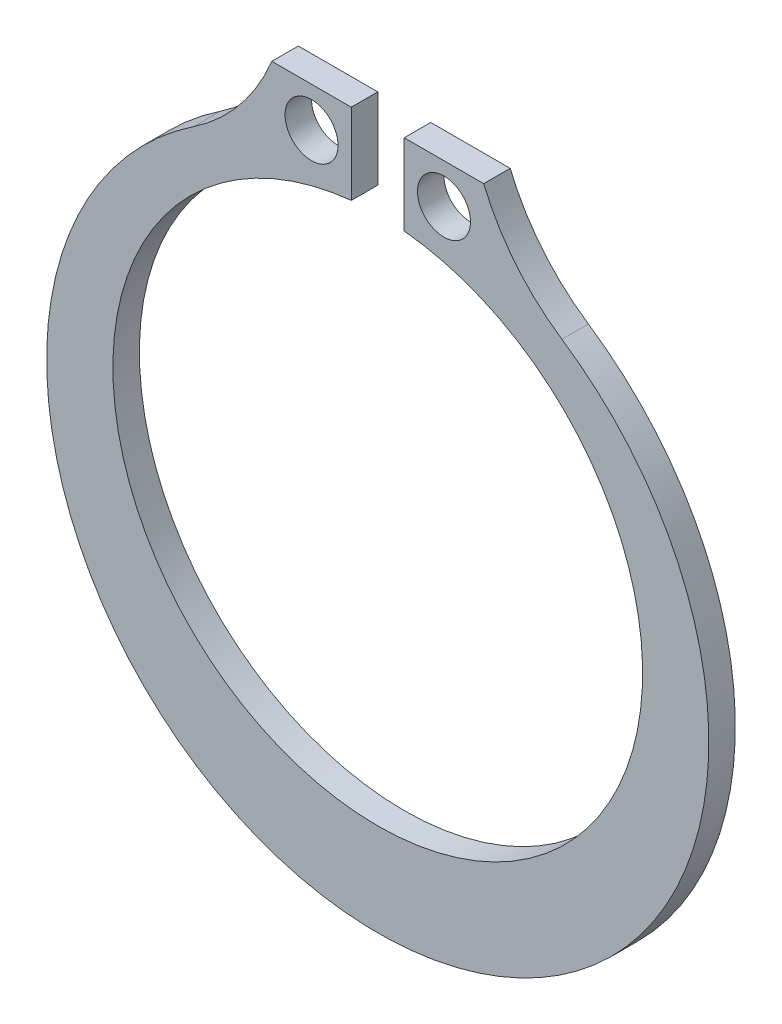
ISO-10303-21;
HEADER;
FILE_DESCRIPTION(('STEP AP214'),'2;1');
FILE_NAME('part.step','',(''),(''),'','','');
FILE_SCHEMA(('AUTOMOTIVE_DESIGN { 1 0 10303 214 1 1 1 1 }'));
ENDSEC;
DATA;
#1=APPLICATION_CONTEXT('core data for automotive mechanical design processes');
#2=APPLICATION_PROTOCOL_DEFINITION('international standard','automotive_design',2000,#1);
#3=PRODUCT_CONTEXT('',#1,'mechanical');
#4=PRODUCT('Part','Part','',(#3));
#5=PRODUCT_RELATED_PRODUCT_CATEGORY('part','',(#4));
#6=PRODUCT_DEFINITION_FORMATION('','',#4);
#7=PRODUCT_DEFINITION_CONTEXT('part definition',#1,'design');
#8=PRODUCT_DEFINITION('design','',#6,#7);
#9=PRODUCT_DEFINITION_SHAPE('','',#8);
#10=(LENGTH_UNIT() NAMED_UNIT(*) SI_UNIT(.MILLI.,.METRE.));
#11=(NAMED_UNIT(*) PLANE_ANGLE_UNIT() SI_UNIT($,.RADIAN.));
#12=(NAMED_UNIT(*) SI_UNIT($,.STERADIAN.) SOLID_ANGLE_UNIT());
#13=UNCERTAINTY_MEASURE_WITH_UNIT(LENGTH_MEASURE(1.E-05),#10,'distance_accuracy_value','');
#14=(GEOMETRIC_REPRESENTATION_CONTEXT(3) GLOBAL_UNCERTAINTY_ASSIGNED_CONTEXT((#13)) GLOBAL_UNIT_ASSIGNED_CONTEXT((#10,
#11,#12)) REPRESENTATION_CONTEXT('',''));
#15=CARTESIAN_POINT('',(0.,0.,0.));
#16=DIRECTION('',(0.,0.,1.));
#17=DIRECTION('',(1.,0.,0.));
#18=AXIS2_PLACEMENT_3D('',#15,#16,#17);
#19=CARTESIAN_POINT('',(-11.4010404379863,17.0372027320039,1.));
#20=DIRECTION('',(0.,0.,-1.));
#21=DIRECTION('',(-1.,0.,0.));
#22=AXIS2_PLACEMENT_3D('',#19,#20,#21);
#23=PLANE('',#22);
#24=CARTESIAN_POINT('',(-11.4010404379863,17.0372027320039,1.));
#25=DIRECTION('',(0.,0.,-1.));
#26=DIRECTION('',(-1.,0.,0.));
#27=AXIS2_PLACEMENT_3D('',#24,#25,#26);
#28=CIRCLE('',#27,8.);
#29=CARTESIAN_POINT('',(-4.,14.,1.));
#30=VERTEX_POINT('',#29);
#31=CARTESIAN_POINT('',(-6.95185392560138,10.3885382512219,1.));
#32=VERTEX_POINT('',#31);
#33=EDGE_CURVE('E151',#30,#32,#28,.T.);
#34=ORIENTED_EDGE('',*,*,#33,.T.);
#35=CARTESIAN_POINT('',(0.,0.,1.));
#36=DIRECTION('',(0.,0.,1.));
#37=DIRECTION('',(1.,0.,0.));
#38=AXIS2_PLACEMENT_3D('',#35,#36,#37);
#39=CIRCLE('',#38,12.5);
#40=CARTESIAN_POINT('',(6.95185392560138,10.3885382512219,1.));
#41=VERTEX_POINT('',#40);
#42=EDGE_CURVE('E99',#32,#41,#39,.T.);
#43=ORIENTED_EDGE('',*,*,#42,.T.);
#44=CARTESIAN_POINT('',(11.4010404379863,17.0372027320039,1.));
#45=DIRECTION('',(0.,0.,-1.));
#46=DIRECTION('',(1.,0.,0.));
#47=AXIS2_PLACEMENT_3D('',#44,#45,#46);
#48=CIRCLE('',#47,8.);
#49=CARTESIAN_POINT('',(4.,14.,1.));
#50=VERTEX_POINT('',#49);
#51=EDGE_CURVE('E166',#41,#50,#48,.T.);
#52=ORIENTED_EDGE('',*,*,#51,.T.);
#53=DIRECTION('',(-1.,0.,0.));
#54=VECTOR('',#53,1.);
#55=CARTESIAN_POINT('',(4.,14.,1.));
#56=LINE('',#55,#54);
#57=CARTESIAN_POINT('',(1.,14.,1.));
#58=VERTEX_POINT('',#57);
#59=EDGE_CURVE('E179',#50,#58,#56,.T.);
#60=ORIENTED_EDGE('',*,*,#59,.T.);
#61=DIRECTION('',(0.,-1.,0.));
#62=VECTOR('',#61,1.);
#63=CARTESIAN_POINT('',(1.,14.,1.));
#64=LINE('',#63,#62);
#65=CARTESIAN_POINT('',(1.,10.9498743710662,1.));
#66=VERTEX_POINT('',#65);
#67=EDGE_CURVE('E118',#58,#66,#64,.T.);
#68=ORIENTED_EDGE('',*,*,#67,.T.);
#69=CARTESIAN_POINT('',(0.,1.,1.));
#70=DIRECTION('',(0.,0.,-1.));
#71=DIRECTION('',(1.,0.,0.));
#72=AXIS2_PLACEMENT_3D('',#69,#70,#71);
#73=CIRCLE('',#72,10.);
#74=CARTESIAN_POINT('',(-1.,10.9498743710662,1.));
#75=VERTEX_POINT('',#74);
#76=EDGE_CURVE('E112',#66,#75,#73,.T.);
#77=ORIENTED_EDGE('',*,*,#76,.T.);
#78=DIRECTION('',(0.,1.,0.));
#79=VECTOR('',#78,1.);
#80=CARTESIAN_POINT('',(-1.,14.,1.));
#81=LINE('',#80,#79);
#82=CARTESIAN_POINT('',(-1.,14.,1.));
#83=VERTEX_POINT('',#82);
#84=EDGE_CURVE('E116',#75,#83,#81,.T.);
#85=ORIENTED_EDGE('',*,*,#84,.T.);
#86=DIRECTION('',(-1.,0.,0.));
#87=VECTOR('',#86,1.);
#88=CARTESIAN_POINT('',(-4.,14.,1.));
#89=LINE('',#88,#87);
#90=EDGE_CURVE('E56',#83,#30,#89,.T.);
#91=ORIENTED_EDGE('',*,*,#90,.T.);
#92=EDGE_LOOP('',(#34,#43,#52,#60,#68,#77,#85,#91));
#93=FACE_BOUND('',#92,.T.);
#94=CARTESIAN_POINT('',(-2.5,12.5,1.));
#95=DIRECTION('',(0.,0.,1.));
#96=DIRECTION('',(1.,0.,0.));
#97=AXIS2_PLACEMENT_3D('',#94,#95,#96);
#98=CIRCLE('',#97,1.);
#99=CARTESIAN_POINT('',(-1.5,12.5,1.));
#100=VERTEX_POINT('',#99);
#101=EDGE_CURVE('E140',#100,#100,#98,.T.);
#102=ORIENTED_EDGE('',*,*,#101,.F.);
#103=EDGE_LOOP('',(#102));
#104=FACE_BOUND('',#103,.T.);
#105=CARTESIAN_POINT('',(2.5,12.5,1.));
#106=DIRECTION('',(0.,0.,1.));
#107=DIRECTION('',(-1.,0.,0.));
#108=AXIS2_PLACEMENT_3D('',#105,#106,#107);
#109=CIRCLE('',#108,1.);
#110=CARTESIAN_POINT('',(1.5,12.5,1.));
#111=VERTEX_POINT('',#110);
#112=EDGE_CURVE('E188',#111,#111,#109,.T.);
#113=ORIENTED_EDGE('',*,*,#112,.F.);
#114=EDGE_LOOP('',(#113));
#115=FACE_BOUND('',#114,.T.);
#116=ADVANCED_FACE('F39',(#93,#104,#115),#23,.F.);
#117=CARTESIAN_POINT('',(-11.4010404379863,17.0372027320039,0.));
#118=DIRECTION('',(0.,0.,-1.));
#119=DIRECTION('',(-1.,0.,0.));
#120=AXIS2_PLACEMENT_3D('',#117,#118,#119);
#121=PLANE('',#120);
#122=CARTESIAN_POINT('',(-2.5,12.5,0.));
#123=DIRECTION('',(0.,0.,1.));
#124=DIRECTION('',(1.,0.,0.));
#125=AXIS2_PLACEMENT_3D('',#122,#123,#124);
#126=CIRCLE('',#125,1.);
#127=CARTESIAN_POINT('',(-1.5,12.5,0.));
#128=VERTEX_POINT('',#127);
#129=EDGE_CURVE('E185',#128,#128,#126,.T.);
#130=ORIENTED_EDGE('',*,*,#129,.T.);
#131=EDGE_LOOP('',(#130));
#132=FACE_BOUND('',#131,.T.);
#133=CARTESIAN_POINT('',(-11.4010404379863,17.0372027320039,0.));
#134=DIRECTION('',(0.,0.,-1.));
#135=DIRECTION('',(-1.,0.,0.));
#136=AXIS2_PLACEMENT_3D('',#133,#134,#135);
#137=CIRCLE('',#136,8.);
#138=CARTESIAN_POINT('',(-4.,14.,0.));
#139=VERTEX_POINT('',#138);
#140=CARTESIAN_POINT('',(-6.95185392560138,10.3885382512219,0.));
#141=VERTEX_POINT('',#140);
#142=EDGE_CURVE('E136',#139,#141,#137,.T.);
#143=ORIENTED_EDGE('',*,*,#142,.F.);
#144=DIRECTION('',(-1.,0.,0.));
#145=VECTOR('',#144,1.);
#146=CARTESIAN_POINT('',(-4.,14.,0.));
#147=LINE('',#146,#145);
#148=CARTESIAN_POINT('',(-1.,14.,0.));
#149=VERTEX_POINT('',#148);
#150=EDGE_CURVE('E91',#149,#139,#147,.T.);
#151=ORIENTED_EDGE('',*,*,#150,.F.);
#152=DIRECTION('',(0.,1.,0.));
#153=VECTOR('',#152,1.);
#154=CARTESIAN_POINT('',(-1.,14.,0.));
#155=LINE('',#154,#153);
#156=CARTESIAN_POINT('',(-1.,10.9498743710662,0.));
#157=VERTEX_POINT('',#156);
#158=EDGE_CURVE('E85',#157,#149,#155,.T.);
#159=ORIENTED_EDGE('',*,*,#158,.F.);
#160=CARTESIAN_POINT('',(0.,1.,0.));
#161=DIRECTION('',(0.,0.,-1.));
#162=DIRECTION('',(1.,0.,0.));
#163=AXIS2_PLACEMENT_3D('',#160,#161,#162);
#164=CIRCLE('',#163,10.);
#165=CARTESIAN_POINT('',(1.,10.9498743710662,0.));
#166=VERTEX_POINT('',#165);
#167=EDGE_CURVE('E126',#166,#157,#164,.T.);
#168=ORIENTED_EDGE('',*,*,#167,.F.);
#169=DIRECTION('',(0.,-1.,0.));
#170=VECTOR('',#169,1.);
#171=CARTESIAN_POINT('',(1.,14.,0.));
#172=LINE('',#171,#170);
#173=CARTESIAN_POINT('',(1.,14.,0.));
#174=VERTEX_POINT('',#173);
#175=EDGE_CURVE('E146',#174,#166,#172,.T.);
#176=ORIENTED_EDGE('',*,*,#175,.F.);
#177=DIRECTION('',(-1.,0.,0.));
#178=VECTOR('',#177,1.);
#179=CARTESIAN_POINT('',(4.,14.,0.));
#180=LINE('',#179,#178);
#181=CARTESIAN_POINT('',(4.,14.,0.));
#182=VERTEX_POINT('',#181);
#183=EDGE_CURVE('E144',#182,#174,#180,.T.);
#184=ORIENTED_EDGE('',*,*,#183,.F.);
#185=CARTESIAN_POINT('',(11.4010404379863,17.0372027320039,0.));
#186=DIRECTION('',(0.,0.,-1.));
#187=DIRECTION('',(1.,0.,0.));
#188=AXIS2_PLACEMENT_3D('',#185,#186,#187);
#189=CIRCLE('',#188,8.);
#190=CARTESIAN_POINT('',(6.95185392560138,10.3885382512219,0.));
#191=VERTEX_POINT('',#190);
#192=EDGE_CURVE('E142',#191,#182,#189,.T.);
#193=ORIENTED_EDGE('',*,*,#192,.F.);
#194=CARTESIAN_POINT('',(0.,0.,0.));
#195=DIRECTION('',(0.,0.,1.));
#196=DIRECTION('',(1.,0.,0.));
#197=AXIS2_PLACEMENT_3D('',#194,#195,#196);
#198=CIRCLE('',#197,12.5);
#199=EDGE_CURVE('E139',#141,#191,#198,.T.);
#200=ORIENTED_EDGE('',*,*,#199,.F.);
#201=EDGE_LOOP('',(#143,#151,#159,#168,#176,#184,#193,#200));
#202=FACE_BOUND('',#201,.T.);
#203=CARTESIAN_POINT('',(2.5,12.5,0.));
#204=DIRECTION('',(0.,0.,1.));
#205=DIRECTION('',(-1.,0.,0.));
#206=AXIS2_PLACEMENT_3D('',#203,#204,#205);
#207=CIRCLE('',#206,1.);
#208=CARTESIAN_POINT('',(1.5,12.5,0.));
#209=VERTEX_POINT('',#208);
#210=EDGE_CURVE('E191',#209,#209,#207,.T.);
#211=ORIENTED_EDGE('',*,*,#210,.T.);
#212=EDGE_LOOP('',(#211));
#213=FACE_BOUND('',#212,.T.);
#214=ADVANCED_FACE('F170',(#132,#202,#213),#121,.T.);
#215=CARTESIAN_POINT('',(-11.4010404379863,17.0372027320039,1.));
#216=DIRECTION('',(0.,0.,-1.));
#217=DIRECTION('',(-1.,0.,0.));
#218=AXIS2_PLACEMENT_3D('',#215,#216,#217);
#219=CYLINDRICAL_SURFACE('',#218,8.);
#220=ORIENTED_EDGE('',*,*,#142,.T.);
#221=DIRECTION('',(0.,0.,-1.));
#222=VECTOR('',#221,1.);
#223=CARTESIAN_POINT('',(-6.95185392560138,10.3885382512219,1.));
#224=LINE('',#223,#222);
#225=EDGE_CURVE('E11',#32,#141,#224,.T.);
#226=ORIENTED_EDGE('',*,*,#225,.F.);
#227=ORIENTED_EDGE('',*,*,#33,.F.);
#228=DIRECTION('',(0.,0.,-1.));
#229=VECTOR('',#228,1.);
#230=CARTESIAN_POINT('',(-4.,14.,1.));
#231=LINE('',#230,#229);
#232=EDGE_CURVE('E132',#30,#139,#231,.T.);
#233=ORIENTED_EDGE('',*,*,#232,.T.);
#234=EDGE_LOOP('',(#220,#226,#227,#233));
#235=FACE_BOUND('',#234,.T.);
#236=ADVANCED_FACE('F41',(#235),#219,.F.);
#237=CARTESIAN_POINT('',(0.,0.,1.));
#238=DIRECTION('',(0.,0.,-1.));
#239=DIRECTION('',(-1.,0.,0.));
#240=AXIS2_PLACEMENT_3D('',#237,#238,#239);
#241=CYLINDRICAL_SURFACE('',#240,12.5);
#242=ORIENTED_EDGE('',*,*,#199,.T.);
#243=DIRECTION('',(0.,0.,-1.));
#244=VECTOR('',#243,1.);
#245=CARTESIAN_POINT('',(6.95185392560138,10.3885382512219,1.));
#246=LINE('',#245,#244);
#247=EDGE_CURVE('E48',#41,#191,#246,.T.);
#248=ORIENTED_EDGE('',*,*,#247,.F.);
#249=ORIENTED_EDGE('',*,*,#42,.F.);
#250=ORIENTED_EDGE('',*,*,#225,.T.);
#251=EDGE_LOOP('',(#242,#248,#249,#250));
#252=FACE_BOUND('',#251,.T.);
#253=ADVANCED_FACE('F223',(#252),#241,.T.);
#254=CARTESIAN_POINT('',(11.4010404379863,17.0372027320039,1.));
#255=DIRECTION('',(0.,0.,-1.));
#256=DIRECTION('',(-1.,0.,0.));
#257=AXIS2_PLACEMENT_3D('',#254,#255,#256);
#258=CYLINDRICAL_SURFACE('',#257,8.);
#259=ORIENTED_EDGE('',*,*,#192,.T.);
#260=DIRECTION('',(0.,0.,-1.));
#261=VECTOR('',#260,1.);
#262=CARTESIAN_POINT('',(4.,14.,1.));
#263=LINE('',#262,#261);
#264=EDGE_CURVE('E158',#50,#182,#263,.T.);
#265=ORIENTED_EDGE('',*,*,#264,.F.);
#266=ORIENTED_EDGE('',*,*,#51,.F.);
#267=ORIENTED_EDGE('',*,*,#247,.T.);
#268=EDGE_LOOP('',(#259,#265,#266,#267));
#269=FACE_BOUND('',#268,.T.);
#270=ADVANCED_FACE('F164',(#269),#258,.F.);
#271=CARTESIAN_POINT('',(4.,14.,1.));
#272=DIRECTION('',(0.,-1.,0.));
#273=DIRECTION('',(0.,0.,-1.));
#274=AXIS2_PLACEMENT_3D('',#271,#272,#273);
#275=PLANE('',#274);
#276=ORIENTED_EDGE('',*,*,#183,.T.);
#277=DIRECTION('',(0.,0.,-1.));
#278=VECTOR('',#277,1.);
#279=CARTESIAN_POINT('',(1.,14.,1.));
#280=LINE('',#279,#278);
#281=EDGE_CURVE('E155',#58,#174,#280,.T.);
#282=ORIENTED_EDGE('',*,*,#281,.F.);
#283=ORIENTED_EDGE('',*,*,#59,.F.);
#284=ORIENTED_EDGE('',*,*,#264,.T.);
#285=EDGE_LOOP('',(#276,#282,#283,#284));
#286=FACE_BOUND('',#285,.T.);
#287=ADVANCED_FACE('F175',(#286),#275,.F.);
#288=CARTESIAN_POINT('',(1.,14.,1.));
#289=DIRECTION('',(1.,0.,0.));
#290=DIRECTION('',(0.,1.,0.));
#291=AXIS2_PLACEMENT_3D('',#288,#289,#290);
#292=PLANE('',#291);
#293=ORIENTED_EDGE('',*,*,#175,.T.);
#294=DIRECTION('',(0.,0.,-1.));
#295=VECTOR('',#294,1.);
#296=CARTESIAN_POINT('',(1.,10.9498743710662,1.));
#297=LINE('',#296,#295);
#298=EDGE_CURVE('E127',#66,#166,#297,.T.);
#299=ORIENTED_EDGE('',*,*,#298,.F.);
#300=ORIENTED_EDGE('',*,*,#67,.F.);
#301=ORIENTED_EDGE('',*,*,#281,.T.);
#302=EDGE_LOOP('',(#293,#299,#300,#301));
#303=FACE_BOUND('',#302,.T.);
#304=ADVANCED_FACE('F178',(#303),#292,.F.);
#305=CARTESIAN_POINT('',(0.,1.,1.));
#306=DIRECTION('',(0.,0.,-1.));
#307=DIRECTION('',(-1.,0.,0.));
#308=AXIS2_PLACEMENT_3D('',#305,#306,#307);
#309=CYLINDRICAL_SURFACE('',#308,10.);
#310=ORIENTED_EDGE('',*,*,#167,.T.);
#311=DIRECTION('',(0.,0.,-1.));
#312=VECTOR('',#311,1.);
#313=CARTESIAN_POINT('',(-1.,10.9498743710662,1.));
#314=LINE('',#313,#312);
#315=EDGE_CURVE('E123',#75,#157,#314,.T.);
#316=ORIENTED_EDGE('',*,*,#315,.F.);
#317=ORIENTED_EDGE('',*,*,#76,.F.);
#318=ORIENTED_EDGE('',*,*,#298,.T.);
#319=EDGE_LOOP('',(#310,#316,#317,#318));
#320=FACE_BOUND('',#319,.T.);
#321=ADVANCED_FACE('F124',(#320),#309,.F.);
#322=CARTESIAN_POINT('',(-1.,14.,1.));
#323=DIRECTION('',(-1.,0.,0.));
#324=DIRECTION('',(0.,-1.,0.));
#325=AXIS2_PLACEMENT_3D('',#322,#323,#324);
#326=PLANE('',#325);
#327=ORIENTED_EDGE('',*,*,#158,.T.);
#328=DIRECTION('',(0.,0.,-1.));
#329=VECTOR('',#328,1.);
#330=CARTESIAN_POINT('',(-1.,14.,1.));
#331=LINE('',#330,#329);
#332=EDGE_CURVE('E128',#83,#149,#331,.T.);
#333=ORIENTED_EDGE('',*,*,#332,.F.);
#334=ORIENTED_EDGE('',*,*,#84,.F.);
#335=ORIENTED_EDGE('',*,*,#315,.T.);
#336=EDGE_LOOP('',(#327,#333,#334,#335));
#337=FACE_BOUND('',#336,.T.);
#338=ADVANCED_FACE('F130',(#337),#326,.F.);
#339=CARTESIAN_POINT('',(-4.,14.,1.));
#340=DIRECTION('',(0.,-1.,0.));
#341=DIRECTION('',(0.,0.,-1.));
#342=AXIS2_PLACEMENT_3D('',#339,#340,#341);
#343=PLANE('',#342);
#344=ORIENTED_EDGE('',*,*,#150,.T.);
#345=ORIENTED_EDGE('',*,*,#232,.F.);
#346=ORIENTED_EDGE('',*,*,#90,.F.);
#347=ORIENTED_EDGE('',*,*,#332,.T.);
#348=EDGE_LOOP('',(#344,#345,#346,#347));
#349=FACE_BOUND('',#348,.T.);
#350=ADVANCED_FACE('F211',(#349),#343,.F.);
#351=CARTESIAN_POINT('',(-2.5,12.5,1.));
#352=DIRECTION('',(0.,0.,-1.));
#353=DIRECTION('',(-1.,0.,0.));
#354=AXIS2_PLACEMENT_3D('',#351,#352,#353);
#355=CYLINDRICAL_SURFACE('',#354,1.);
#356=ORIENTED_EDGE('',*,*,#101,.T.);
#357=EDGE_LOOP('',(#356));
#358=FACE_BOUND('',#357,.T.);
#359=ORIENTED_EDGE('',*,*,#129,.F.);
#360=EDGE_LOOP('',(#359));
#361=FACE_BOUND('',#360,.T.);
#362=ADVANCED_FACE('F208',(#358,#361),#355,.F.);
#363=CARTESIAN_POINT('',(2.5,12.5,1.));
#364=DIRECTION('',(0.,0.,-1.));
#365=DIRECTION('',(-1.,0.,0.));
#366=AXIS2_PLACEMENT_3D('',#363,#364,#365);
#367=CYLINDRICAL_SURFACE('',#366,1.);
#368=ORIENTED_EDGE('',*,*,#112,.T.);
#369=EDGE_LOOP('',(#368));
#370=FACE_BOUND('',#369,.T.);
#371=ORIENTED_EDGE('',*,*,#210,.F.);
#372=EDGE_LOOP('',(#371));
#373=FACE_BOUND('',#372,.T.);
#374=ADVANCED_FACE('F197',(#370,#373),#367,.F.);
#375=CLOSED_SHELL('',(#116,#214,#236,#253,#270,#287,#304,#321,#338,#350,#362,#374));
#376=MANIFOLD_SOLID_BREP('B2',#375);
#377=ADVANCED_BREP_SHAPE_REPRESENTATION('',(#18,#376),#14);
#378=SHAPE_DEFINITION_REPRESENTATION(#9,#377);
ENDSEC;
END-ISO-10303-21;
